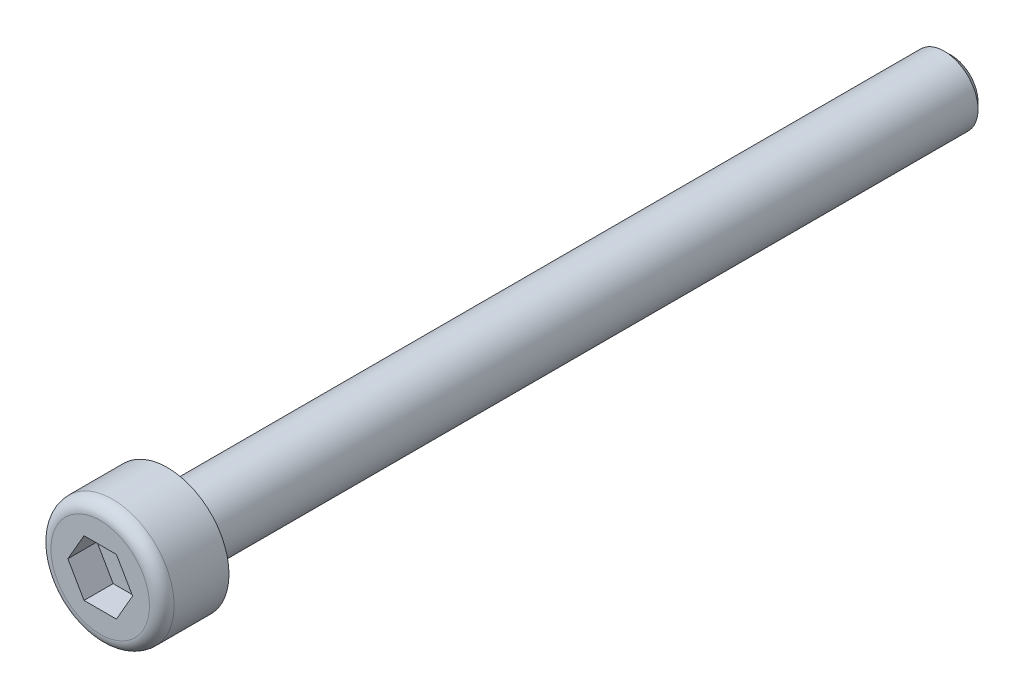
ISO-10303-21;
HEADER;
FILE_DESCRIPTION(('STEP AP214'),'2;1');
FILE_NAME('part.step','',(''),(''),'','','');
FILE_SCHEMA(('AUTOMOTIVE_DESIGN { 1 0 10303 214 1 1 1 1 }'));
ENDSEC;
DATA;
#1=APPLICATION_CONTEXT('core data for automotive mechanical design processes');
#2=APPLICATION_PROTOCOL_DEFINITION('international standard','automotive_design',2000,#1);
#3=PRODUCT_CONTEXT('',#1,'mechanical');
#4=PRODUCT('Part','Part','',(#3));
#5=PRODUCT_RELATED_PRODUCT_CATEGORY('part','',(#4));
#6=PRODUCT_DEFINITION_FORMATION('','',#4);
#7=PRODUCT_DEFINITION_CONTEXT('part definition',#1,'design');
#8=PRODUCT_DEFINITION('design','',#6,#7);
#9=PRODUCT_DEFINITION_SHAPE('','',#8);
#10=(LENGTH_UNIT() NAMED_UNIT(*) SI_UNIT(.MILLI.,.METRE.));
#11=(NAMED_UNIT(*) PLANE_ANGLE_UNIT() SI_UNIT($,.RADIAN.));
#12=(NAMED_UNIT(*) SI_UNIT($,.STERADIAN.) SOLID_ANGLE_UNIT());
#13=UNCERTAINTY_MEASURE_WITH_UNIT(LENGTH_MEASURE(1.E-05),#10,'distance_accuracy_value','');
#14=(GEOMETRIC_REPRESENTATION_CONTEXT(3) GLOBAL_UNCERTAINTY_ASSIGNED_CONTEXT((#13)) GLOBAL_UNIT_ASSIGNED_CONTEXT((#10,
#11,#12)) REPRESENTATION_CONTEXT('',''));
#15=CARTESIAN_POINT('',(0.,0.,0.));
#16=DIRECTION('',(0.,0.,1.));
#17=DIRECTION('',(1.,0.,0.));
#18=AXIS2_PLACEMENT_3D('',#15,#16,#17);
#19=CARTESIAN_POINT('',(0.,0.,1.7));
#20=DIRECTION('',(0.,0.,1.));
#21=DIRECTION('',(1.,0.,0.));
#22=AXIS2_PLACEMENT_3D('',#19,#20,#21);
#23=PLANE('',#22);
#24=DIRECTION('',(-0.50000000000019,0.866025403784329,0.));
#25=VECTOR('',#24,1.);
#26=CARTESIAN_POINT('',(1.445,0.,1.7));
#27=LINE('',#26,#25);
#28=CARTESIAN_POINT('',(1.445,0.,1.7));
#29=VERTEX_POINT('',#28);
#30=CARTESIAN_POINT('',(0.7225,1.251406708469,1.7));
#31=VERTEX_POINT('',#30);
#32=EDGE_CURVE('E10',#29,#31,#27,.T.);
#33=ORIENTED_EDGE('',*,*,#32,.T.);
#34=DIRECTION('',(-1.,0.,0.));
#35=VECTOR('',#34,1.);
#36=CARTESIAN_POINT('',(0.7225,1.251406708469,1.7));
#37=LINE('',#36,#35);
#38=CARTESIAN_POINT('',(-0.7225,1.251406708469,1.7));
#39=VERTEX_POINT('',#38);
#40=EDGE_CURVE('E25',#31,#39,#37,.T.);
#41=ORIENTED_EDGE('',*,*,#40,.T.);
#42=DIRECTION('',(-0.50000000000019,-0.866025403784329,0.));
#43=VECTOR('',#42,1.);
#44=CARTESIAN_POINT('',(-0.7225,1.251406708469,1.7));
#45=LINE('',#44,#43);
#46=CARTESIAN_POINT('',(-1.445,0.,1.7));
#47=VERTEX_POINT('',#46);
#48=EDGE_CURVE('E187',#39,#47,#45,.T.);
#49=ORIENTED_EDGE('',*,*,#48,.T.);
#50=DIRECTION('',(0.50000000000019,-0.866025403784329,0.));
#51=VECTOR('',#50,1.);
#52=CARTESIAN_POINT('',(-1.445,0.,1.7));
#53=LINE('',#52,#51);
#54=CARTESIAN_POINT('',(-0.7225,-1.251406708469,1.7));
#55=VERTEX_POINT('',#54);
#56=EDGE_CURVE('E188',#47,#55,#53,.T.);
#57=ORIENTED_EDGE('',*,*,#56,.T.);
#58=DIRECTION('',(1.,0.,0.));
#59=VECTOR('',#58,1.);
#60=CARTESIAN_POINT('',(-0.7225,-1.251406708469,1.7));
#61=LINE('',#60,#59);
#62=CARTESIAN_POINT('',(0.7225,-1.251406708469,1.7));
#63=VERTEX_POINT('',#62);
#64=EDGE_CURVE('E183',#55,#63,#61,.T.);
#65=ORIENTED_EDGE('',*,*,#64,.T.);
#66=DIRECTION('',(0.50000000000019,0.866025403784329,0.));
#67=VECTOR('',#66,1.);
#68=CARTESIAN_POINT('',(0.7225,-1.251406708469,1.7));
#69=LINE('',#68,#67);
#70=EDGE_CURVE('E177',#63,#29,#69,.T.);
#71=ORIENTED_EDGE('',*,*,#70,.T.);
#72=EDGE_LOOP('',(#33,#41,#49,#57,#65,#71));
#73=FACE_BOUND('',#72,.T.);
#74=ADVANCED_FACE('F16',(#73),#23,.T.);
#75=CARTESIAN_POINT('',(1.445,0.,1.7));
#76=DIRECTION('',(-0.866025403784329,-0.50000000000019,0.));
#77=DIRECTION('',(-0.50000000000019,0.866025403784329,0.));
#78=AXIS2_PLACEMENT_3D('',#75,#76,#77);
#79=PLANE('',#78);
#80=DIRECTION('',(0.,0.,1.));
#81=VECTOR('',#80,1.);
#82=CARTESIAN_POINT('',(1.445,0.,1.7));
#83=LINE('',#82,#81);
#84=CARTESIAN_POINT('',(1.445,0.,3.));
#85=VERTEX_POINT('',#84);
#86=EDGE_CURVE('E174',#29,#85,#83,.T.);
#87=ORIENTED_EDGE('',*,*,#86,.T.);
#88=DIRECTION('',(-0.50000000000019,0.866025403784329,0.));
#89=VECTOR('',#88,1.);
#90=CARTESIAN_POINT('',(1.445,0.,3.));
#91=LINE('',#90,#89);
#92=CARTESIAN_POINT('',(0.7225,1.251406708469,3.));
#93=VERTEX_POINT('',#92);
#94=EDGE_CURVE('E163',#85,#93,#91,.T.);
#95=ORIENTED_EDGE('',*,*,#94,.T.);
#96=DIRECTION('',(0.,0.,1.));
#97=VECTOR('',#96,1.);
#98=CARTESIAN_POINT('',(0.7225,1.251406708469,1.7));
#99=LINE('',#98,#97);
#100=EDGE_CURVE('E198',#31,#93,#99,.T.);
#101=ORIENTED_EDGE('',*,*,#100,.F.);
#102=ORIENTED_EDGE('',*,*,#32,.F.);
#103=EDGE_LOOP('',(#87,#95,#101,#102));
#104=FACE_BOUND('',#103,.T.);
#105=ADVANCED_FACE('F250',(#104),#79,.T.);
#106=CARTESIAN_POINT('',(0.7225,1.251406708469,1.7));
#107=DIRECTION('',(0.,-1.,0.));
#108=DIRECTION('',(-1.,0.,0.));
#109=AXIS2_PLACEMENT_3D('',#106,#107,#108);
#110=PLANE('',#109);
#111=ORIENTED_EDGE('',*,*,#100,.T.);
#112=DIRECTION('',(-1.,0.,0.));
#113=VECTOR('',#112,1.);
#114=CARTESIAN_POINT('',(0.7225,1.251406708469,3.));
#115=LINE('',#114,#113);
#116=CARTESIAN_POINT('',(-0.7225,1.251406708469,3.));
#117=VERTEX_POINT('',#116);
#118=EDGE_CURVE('E159',#93,#117,#115,.T.);
#119=ORIENTED_EDGE('',*,*,#118,.T.);
#120=DIRECTION('',(0.,0.,1.));
#121=VECTOR('',#120,1.);
#122=CARTESIAN_POINT('',(-0.7225,1.251406708469,1.7));
#123=LINE('',#122,#121);
#124=EDGE_CURVE('E184',#39,#117,#123,.T.);
#125=ORIENTED_EDGE('',*,*,#124,.F.);
#126=ORIENTED_EDGE('',*,*,#40,.F.);
#127=EDGE_LOOP('',(#111,#119,#125,#126));
#128=FACE_BOUND('',#127,.T.);
#129=ADVANCED_FACE('F18',(#128),#110,.T.);
#130=CARTESIAN_POINT('',(-0.7225,1.251406708469,1.7));
#131=DIRECTION('',(0.866025403784329,-0.50000000000019,0.));
#132=DIRECTION('',(0.,0.,-1.));
#133=AXIS2_PLACEMENT_3D('',#130,#131,#132);
#134=PLANE('',#133);
#135=ORIENTED_EDGE('',*,*,#124,.T.);
#136=DIRECTION('',(-0.50000000000019,-0.866025403784329,0.));
#137=VECTOR('',#136,1.);
#138=CARTESIAN_POINT('',(-0.7225,1.251406708469,3.));
#139=LINE('',#138,#137);
#140=CARTESIAN_POINT('',(-1.445,0.,3.));
#141=VERTEX_POINT('',#140);
#142=EDGE_CURVE('E136',#117,#141,#139,.T.);
#143=ORIENTED_EDGE('',*,*,#142,.T.);
#144=DIRECTION('',(0.,0.,1.));
#145=VECTOR('',#144,1.);
#146=CARTESIAN_POINT('',(-1.445,0.,1.7));
#147=LINE('',#146,#145);
#148=EDGE_CURVE('E191',#47,#141,#147,.T.);
#149=ORIENTED_EDGE('',*,*,#148,.F.);
#150=ORIENTED_EDGE('',*,*,#48,.F.);
#151=EDGE_LOOP('',(#135,#143,#149,#150));
#152=FACE_BOUND('',#151,.T.);
#153=ADVANCED_FACE('F309',(#152),#134,.T.);
#154=CARTESIAN_POINT('',(-1.445,0.,1.7));
#155=DIRECTION('',(0.866025403784329,0.50000000000019,0.));
#156=DIRECTION('',(0.,0.,-1.));
#157=AXIS2_PLACEMENT_3D('',#154,#155,#156);
#158=PLANE('',#157);
#159=ORIENTED_EDGE('',*,*,#148,.T.);
#160=DIRECTION('',(0.50000000000019,-0.866025403784329,0.));
#161=VECTOR('',#160,1.);
#162=CARTESIAN_POINT('',(-1.445,0.,3.));
#163=LINE('',#162,#161);
#164=CARTESIAN_POINT('',(-0.7225,-1.251406708469,3.));
#165=VERTEX_POINT('',#164);
#166=EDGE_CURVE('E132',#141,#165,#163,.T.);
#167=ORIENTED_EDGE('',*,*,#166,.T.);
#168=DIRECTION('',(0.,0.,1.));
#169=VECTOR('',#168,1.);
#170=CARTESIAN_POINT('',(-0.7225,-1.251406708469,1.7));
#171=LINE('',#170,#169);
#172=EDGE_CURVE('E180',#55,#165,#171,.T.);
#173=ORIENTED_EDGE('',*,*,#172,.F.);
#174=ORIENTED_EDGE('',*,*,#56,.F.);
#175=EDGE_LOOP('',(#159,#167,#173,#174));
#176=FACE_BOUND('',#175,.T.);
#177=ADVANCED_FACE('F300',(#176),#158,.T.);
#178=CARTESIAN_POINT('',(-0.7225,-1.251406708469,1.7));
#179=DIRECTION('',(0.,1.,0.));
#180=DIRECTION('',(1.,0.,0.));
#181=AXIS2_PLACEMENT_3D('',#178,#179,#180);
#182=PLANE('',#181);
#183=ORIENTED_EDGE('',*,*,#172,.T.);
#184=DIRECTION('',(1.,0.,0.));
#185=VECTOR('',#184,1.);
#186=CARTESIAN_POINT('',(-0.7225,-1.251406708469,3.));
#187=LINE('',#186,#185);
#188=CARTESIAN_POINT('',(0.7225,-1.251406708469,3.));
#189=VERTEX_POINT('',#188);
#190=EDGE_CURVE('E137',#165,#189,#187,.T.);
#191=ORIENTED_EDGE('',*,*,#190,.T.);
#192=DIRECTION('',(0.,0.,1.));
#193=VECTOR('',#192,1.);
#194=CARTESIAN_POINT('',(0.7225,-1.251406708469,1.7));
#195=LINE('',#194,#193);
#196=EDGE_CURVE('E171',#63,#189,#195,.T.);
#197=ORIENTED_EDGE('',*,*,#196,.F.);
#198=ORIENTED_EDGE('',*,*,#64,.F.);
#199=EDGE_LOOP('',(#183,#191,#197,#198));
#200=FACE_BOUND('',#199,.T.);
#201=ADVANCED_FACE('F283',(#200),#182,.T.);
#202=CARTESIAN_POINT('',(0.7225,-1.251406708469,1.7));
#203=DIRECTION('',(-0.866025403784329,0.50000000000019,0.));
#204=DIRECTION('',(0.,0.,1.));
#205=AXIS2_PLACEMENT_3D('',#202,#203,#204);
#206=PLANE('',#205);
#207=ORIENTED_EDGE('',*,*,#196,.T.);
#208=DIRECTION('',(0.50000000000019,0.866025403784329,0.));
#209=VECTOR('',#208,1.);
#210=CARTESIAN_POINT('',(0.7225,-1.251406708469,3.));
#211=LINE('',#210,#209);
#212=EDGE_CURVE('E167',#189,#85,#211,.T.);
#213=ORIENTED_EDGE('',*,*,#212,.T.);
#214=ORIENTED_EDGE('',*,*,#86,.F.);
#215=ORIENTED_EDGE('',*,*,#70,.F.);
#216=EDGE_LOOP('',(#207,#213,#214,#215));
#217=FACE_BOUND('',#216,.T.);
#218=ADVANCED_FACE('F274',(#217),#206,.T.);
#219=CARTESIAN_POINT('',(0.,0.,3.));
#220=DIRECTION('',(0.,0.,1.));
#221=DIRECTION('',(1.,0.,0.));
#222=AXIS2_PLACEMENT_3D('',#219,#220,#221);
#223=PLANE('',#222);
#224=ORIENTED_EDGE('',*,*,#190,.F.);
#225=ORIENTED_EDGE('',*,*,#166,.F.);
#226=ORIENTED_EDGE('',*,*,#142,.F.);
#227=ORIENTED_EDGE('',*,*,#118,.F.);
#228=ORIENTED_EDGE('',*,*,#94,.F.);
#229=ORIENTED_EDGE('',*,*,#212,.F.);
#230=EDGE_LOOP('',(#224,#225,#226,#227,#228,#229));
#231=FACE_BOUND('',#230,.T.);
#232=CARTESIAN_POINT('',(0.,0.,3.));
#233=DIRECTION('',(0.,0.,1.));
#234=DIRECTION('',(1.,0.,0.));
#235=AXIS2_PLACEMENT_3D('',#232,#233,#234);
#236=CIRCLE('',#235,2.2);
#237=CARTESIAN_POINT('',(2.2,0.,3.));
#238=VERTEX_POINT('',#237);
#239=EDGE_CURVE('E142',#238,#238,#236,.T.);
#240=ORIENTED_EDGE('',*,*,#239,.T.);
#241=EDGE_LOOP('',(#240));
#242=FACE_BOUND('',#241,.T.);
#243=ADVANCED_FACE('F265',(#231,#242),#223,.T.);
#244=CARTESIAN_POINT('',(0.,0.,2.45));
#245=DIRECTION('',(0.,0.,1.));
#246=DIRECTION('',(1.,0.,0.));
#247=AXIS2_PLACEMENT_3D('',#244,#245,#246);
#248=TOROIDAL_SURFACE('',#247,2.2,0.55);
#249=CARTESIAN_POINT('',(0.,0.,2.45));
#250=DIRECTION('',(0.,0.,1.));
#251=DIRECTION('',(1.,0.,0.));
#252=AXIS2_PLACEMENT_3D('',#249,#250,#251);
#253=CIRCLE('',#252,2.75);
#254=CARTESIAN_POINT('',(2.75,0.,2.45));
#255=VERTEX_POINT('',#254);
#256=EDGE_CURVE('E113',#255,#255,#253,.T.);
#257=ORIENTED_EDGE('',*,*,#256,.T.);
#258=CARTESIAN_POINT('',(2.2,0.,2.45));
#259=DIRECTION('',(0.,-1.,0.));
#260=DIRECTION('',(1.,0.,0.));
#261=AXIS2_PLACEMENT_3D('',#258,#259,#260);
#262=CIRCLE('',#261,0.55);
#263=EDGE_CURVE('E120',#255,#238,#262,.T.);
#264=ORIENTED_EDGE('',*,*,#263,.T.);
#265=ORIENTED_EDGE('',*,*,#239,.F.);
#266=ORIENTED_EDGE('',*,*,#263,.F.);
#267=EDGE_LOOP('',(#257,#264,#265,#266));
#268=FACE_BOUND('',#267,.T.);
#269=ADVANCED_FACE('F224',(#268),#248,.T.);
#270=CARTESIAN_POINT('',(0.,0.,0.));
#271=DIRECTION('',(0.,0.,1.));
#272=DIRECTION('',(1.,0.,0.));
#273=AXIS2_PLACEMENT_3D('',#270,#271,#272);
#274=CYLINDRICAL_SURFACE('',#273,2.75);
#275=CARTESIAN_POINT('',(0.,0.,0.));
#276=DIRECTION('',(0.,0.,1.));
#277=DIRECTION('',(1.,0.,0.));
#278=AXIS2_PLACEMENT_3D('',#275,#276,#277);
#279=CIRCLE('',#278,2.75);
#280=CARTESIAN_POINT('',(2.75,0.,0.));
#281=VERTEX_POINT('',#280);
#282=EDGE_CURVE('E111',#281,#281,#279,.T.);
#283=ORIENTED_EDGE('',*,*,#282,.T.);
#284=DIRECTION('',(0.,0.,1.));
#285=VECTOR('',#284,1.);
#286=CARTESIAN_POINT('',(2.75,0.,0.));
#287=LINE('',#286,#285);
#288=EDGE_CURVE('E108',#281,#255,#287,.T.);
#289=ORIENTED_EDGE('',*,*,#288,.T.);
#290=ORIENTED_EDGE('',*,*,#256,.F.);
#291=ORIENTED_EDGE('',*,*,#288,.F.);
#292=EDGE_LOOP('',(#283,#289,#290,#291));
#293=FACE_BOUND('',#292,.T.);
#294=ADVANCED_FACE('F109',(#293),#274,.T.);
#295=CARTESIAN_POINT('',(0.,0.,0.));
#296=DIRECTION('',(0.,0.,1.));
#297=DIRECTION('',(1.,0.,0.));
#298=AXIS2_PLACEMENT_3D('',#295,#296,#297);
#299=PLANE('',#298);
#300=ORIENTED_EDGE('',*,*,#282,.F.);
#301=EDGE_LOOP('',(#300));
#302=FACE_BOUND('',#301,.T.);
#303=CARTESIAN_POINT('',(0.,0.,0.));
#304=DIRECTION('',(0.,0.,1.));
#305=DIRECTION('',(1.,0.,0.));
#306=AXIS2_PLACEMENT_3D('',#303,#304,#305);
#307=CIRCLE('',#306,1.5);
#308=CARTESIAN_POINT('',(1.5,0.,0.));
#309=VERTEX_POINT('',#308);
#310=EDGE_CURVE('E123',#309,#309,#307,.T.);
#311=ORIENTED_EDGE('',*,*,#310,.T.);
#312=EDGE_LOOP('',(#311));
#313=FACE_BOUND('',#312,.T.);
#314=ADVANCED_FACE('F223',(#302,#313),#299,.F.);
#315=CARTESIAN_POINT('',(0.,0.,-34.7));
#316=DIRECTION('',(0.,0.,1.));
#317=DIRECTION('',(1.,0.,0.));
#318=AXIS2_PLACEMENT_3D('',#315,#316,#317);
#319=CYLINDRICAL_SURFACE('',#318,1.5);
#320=CARTESIAN_POINT('',(0.,0.,-34.7));
#321=DIRECTION('',(0.,0.,1.));
#322=DIRECTION('',(1.,0.,0.));
#323=AXIS2_PLACEMENT_3D('',#320,#321,#322);
#324=CIRCLE('',#323,1.5);
#325=CARTESIAN_POINT('',(1.5,0.,-34.7));
#326=VERTEX_POINT('',#325);
#327=EDGE_CURVE('E131',#326,#326,#324,.T.);
#328=ORIENTED_EDGE('',*,*,#327,.T.);
#329=DIRECTION('',(0.,0.,1.));
#330=VECTOR('',#329,1.);
#331=CARTESIAN_POINT('',(1.5,0.,-34.7));
#332=LINE('',#331,#330);
#333=EDGE_CURVE('E141',#326,#309,#332,.T.);
#334=ORIENTED_EDGE('',*,*,#333,.T.);
#335=ORIENTED_EDGE('',*,*,#310,.F.);
#336=ORIENTED_EDGE('',*,*,#333,.F.);
#337=EDGE_LOOP('',(#328,#334,#335,#336));
#338=FACE_BOUND('',#337,.T.);
#339=ADVANCED_FACE('F233',(#338),#319,.T.);
#340=CARTESIAN_POINT('',(0.,0.,-35.));
#341=DIRECTION('',(0.,0.,1.));
#342=DIRECTION('',(1.,0.,0.));
#343=AXIS2_PLACEMENT_3D('',#340,#341,#342);
#344=CONICAL_SURFACE('',#343,1.2,0.785398163397);
#345=CARTESIAN_POINT('',(0.,0.,-35.));
#346=DIRECTION('',(0.,0.,1.));
#347=DIRECTION('',(1.,0.,0.));
#348=AXIS2_PLACEMENT_3D('',#345,#346,#347);
#349=CIRCLE('',#348,1.2);
#350=CARTESIAN_POINT('',(1.2,0.,-35.));
#351=VERTEX_POINT('',#350);
#352=EDGE_CURVE('E127',#351,#351,#349,.T.);
#353=ORIENTED_EDGE('',*,*,#352,.T.);
#354=DIRECTION('',(0.707106781186548,0.,0.707106781186548));
#355=VECTOR('',#354,1.);
#356=CARTESIAN_POINT('',(1.2,0.,-35.));
#357=LINE('',#356,#355);
#358=EDGE_CURVE('E128',#351,#326,#357,.T.);
#359=ORIENTED_EDGE('',*,*,#358,.T.);
#360=ORIENTED_EDGE('',*,*,#327,.F.);
#361=ORIENTED_EDGE('',*,*,#358,.F.);
#362=EDGE_LOOP('',(#353,#359,#360,#361));
#363=FACE_BOUND('',#362,.T.);
#364=ADVANCED_FACE('F212',(#363),#344,.T.);
#365=CARTESIAN_POINT('',(0.,0.,-35.));
#366=DIRECTION('',(0.,0.,1.));
#367=DIRECTION('',(1.,0.,0.));
#368=AXIS2_PLACEMENT_3D('',#365,#366,#367);
#369=PLANE('',#368);
#370=ORIENTED_EDGE('',*,*,#352,.F.);
#371=EDGE_LOOP('',(#370));
#372=FACE_BOUND('',#371,.T.);
#373=ADVANCED_FACE('F207',(#372),#369,.F.);
#374=CLOSED_SHELL('',(#74,#105,#129,#153,#177,#201,#218,#243,#269,#294,#314,#339,#364,#373));
#375=MANIFOLD_SOLID_BREP('B1',#374);
#376=ADVANCED_BREP_SHAPE_REPRESENTATION('',(#18,#375),#14);
#377=SHAPE_DEFINITION_REPRESENTATION(#9,#376);
ENDSEC;
END-ISO-10303-21;
